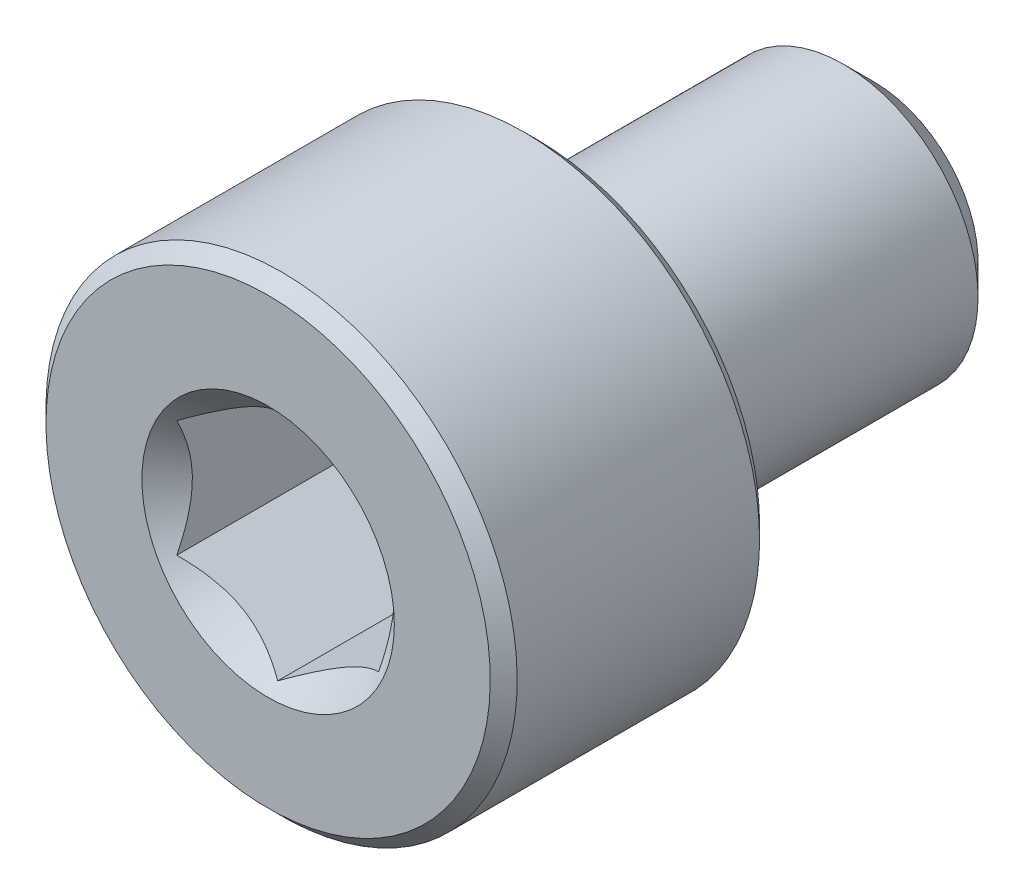
ISO-10303-21;
HEADER;
FILE_DESCRIPTION(('STEP AP214'),'2;1');
FILE_NAME('part.step','',(''),(''),'','','');
FILE_SCHEMA(('AUTOMOTIVE_DESIGN { 1 0 10303 214 1 1 1 1 }'));
ENDSEC;
DATA;
#1=APPLICATION_CONTEXT('core data for automotive mechanical design processes');
#2=APPLICATION_PROTOCOL_DEFINITION('international standard','automotive_design',2000,#1);
#3=PRODUCT_CONTEXT('',#1,'mechanical');
#4=PRODUCT('Part','Part','',(#3));
#5=PRODUCT_RELATED_PRODUCT_CATEGORY('part','',(#4));
#6=PRODUCT_DEFINITION_FORMATION('','',#4);
#7=PRODUCT_DEFINITION_CONTEXT('part definition',#1,'design');
#8=PRODUCT_DEFINITION('design','',#6,#7);
#9=PRODUCT_DEFINITION_SHAPE('','',#8);
#10=(LENGTH_UNIT() NAMED_UNIT(*) SI_UNIT(.MILLI.,.METRE.));
#11=(NAMED_UNIT(*) PLANE_ANGLE_UNIT() SI_UNIT($,.RADIAN.));
#12=(NAMED_UNIT(*) SI_UNIT($,.STERADIAN.) SOLID_ANGLE_UNIT());
#13=UNCERTAINTY_MEASURE_WITH_UNIT(LENGTH_MEASURE(1.E-05),#10,'distance_accuracy_value','');
#14=(GEOMETRIC_REPRESENTATION_CONTEXT(3) GLOBAL_UNCERTAINTY_ASSIGNED_CONTEXT((#13)) GLOBAL_UNIT_ASSIGNED_CONTEXT((#10,
#11,#12)) REPRESENTATION_CONTEXT('',''));
#15=CARTESIAN_POINT('',(0.,0.,0.));
#16=DIRECTION('',(0.,0.,1.));
#17=DIRECTION('',(1.,0.,0.));
#18=AXIS2_PLACEMENT_3D('',#15,#16,#17);
#19=CARTESIAN_POINT('',(0.,1.54533666301317,-4.5));
#20=DIRECTION('',(0.,0.,-1.));
#21=DIRECTION('',(0.,1.,0.));
#22=AXIS2_PLACEMENT_3D('',#19,#20,#21);
#23=PLANE('',#22);
#24=CARTESIAN_POINT('',(0.,0.,-4.5));
#25=DIRECTION('',(0.,0.,-1.));
#26=DIRECTION('',(0.,1.,0.));
#27=AXIS2_PLACEMENT_3D('',#24,#25,#26);
#28=CIRCLE('',#27,1.54533666301317);
#29=CARTESIAN_POINT('',(0.,1.54533666301317,-4.5));
#30=VERTEX_POINT('',#29);
#31=EDGE_CURVE('E58',#30,#30,#28,.T.);
#32=ORIENTED_EDGE('',*,*,#31,.T.);
#33=EDGE_LOOP('',(#32));
#34=FACE_BOUND('',#33,.T.);
#35=ADVANCED_FACE('F45',(#34),#23,.T.);
#36=CARTESIAN_POINT('',(0.,0.,-4.5));
#37=DIRECTION('',(0.,0.,1.));
#38=DIRECTION('',(0.,-1.,0.));
#39=AXIS2_PLACEMENT_3D('',#36,#37,#38);
#40=CONICAL_SURFACE('',#39,1.54533666301317,0.785398163397445);
#41=CARTESIAN_POINT('',(0.,0.,-4.04533666301317));
#42=DIRECTION('',(0.,0.,-1.));
#43=DIRECTION('',(0.,1.,0.));
#44=AXIS2_PLACEMENT_3D('',#41,#42,#43);
#45=CIRCLE('',#44,2.);
#46=CARTESIAN_POINT('',(0.,2.,-4.04533666301317));
#47=VERTEX_POINT('',#46);
#48=EDGE_CURVE('E161',#47,#47,#45,.T.);
#49=ORIENTED_EDGE('',*,*,#48,.T.);
#50=EDGE_LOOP('',(#49));
#51=FACE_BOUND('',#50,.T.);
#52=ORIENTED_EDGE('',*,*,#31,.F.);
#53=EDGE_LOOP('',(#52));
#54=FACE_BOUND('',#53,.T.);
#55=ADVANCED_FACE('F167',(#51,#54),#40,.T.);
#56=CARTESIAN_POINT('',(0.,0.,-4.5));
#57=DIRECTION('',(0.,0.,-1.));
#58=DIRECTION('',(0.,1.,0.));
#59=AXIS2_PLACEMENT_3D('',#56,#57,#58);
#60=CYLINDRICAL_SURFACE('',#59,2.);
#61=CARTESIAN_POINT('',(0.,0.,0.3));
#62=DIRECTION('',(0.,0.,-1.));
#63=DIRECTION('',(0.,1.,0.));
#64=AXIS2_PLACEMENT_3D('',#61,#62,#63);
#65=CIRCLE('',#64,2.);
#66=CARTESIAN_POINT('',(0.,2.,0.3));
#67=VERTEX_POINT('',#66);
#68=EDGE_CURVE('E158',#67,#67,#65,.T.);
#69=ORIENTED_EDGE('',*,*,#68,.T.);
#70=EDGE_LOOP('',(#69));
#71=FACE_BOUND('',#70,.T.);
#72=ORIENTED_EDGE('',*,*,#48,.F.);
#73=EDGE_LOOP('',(#72));
#74=FACE_BOUND('',#73,.T.);
#75=ADVANCED_FACE('F169',(#71,#74),#60,.T.);
#76=CARTESIAN_POINT('',(0.,0.,0.3));
#77=DIRECTION('',(0.,0.,-1.));
#78=DIRECTION('',(0.,1.,0.));
#79=AXIS2_PLACEMENT_3D('',#76,#77,#78);
#80=TOROIDAL_SURFACE('',#79,2.2,0.2);
#81=CARTESIAN_POINT('',(0.,0.,0.5));
#82=DIRECTION('',(0.,0.,-1.));
#83=DIRECTION('',(0.,1.,0.));
#84=AXIS2_PLACEMENT_3D('',#81,#82,#83);
#85=CIRCLE('',#84,2.2);
#86=CARTESIAN_POINT('',(0.,2.2,0.5));
#87=VERTEX_POINT('',#86);
#88=EDGE_CURVE('E155',#87,#87,#85,.T.);
#89=ORIENTED_EDGE('',*,*,#88,.T.);
#90=EDGE_LOOP('',(#89));
#91=FACE_BOUND('',#90,.T.);
#92=ORIENTED_EDGE('',*,*,#68,.F.);
#93=EDGE_LOOP('',(#92));
#94=FACE_BOUND('',#93,.T.);
#95=ADVANCED_FACE('F175',(#91,#94),#80,.F.);
#96=CARTESIAN_POINT('',(0.,3.3,0.5));
#97=DIRECTION('',(0.,0.,-1.));
#98=DIRECTION('',(0.,1.,0.));
#99=AXIS2_PLACEMENT_3D('',#96,#97,#98);
#100=PLANE('',#99);
#101=CARTESIAN_POINT('',(0.,0.,0.5));
#102=DIRECTION('',(0.,0.,-1.));
#103=DIRECTION('',(0.,1.,0.));
#104=AXIS2_PLACEMENT_3D('',#101,#102,#103);
#105=CIRCLE('',#104,3.3);
#106=CARTESIAN_POINT('',(0.,3.3,0.5));
#107=VERTEX_POINT('',#106);
#108=EDGE_CURVE('E152',#107,#107,#105,.T.);
#109=ORIENTED_EDGE('',*,*,#108,.T.);
#110=EDGE_LOOP('',(#109));
#111=FACE_BOUND('',#110,.T.);
#112=ORIENTED_EDGE('',*,*,#88,.F.);
#113=EDGE_LOOP('',(#112));
#114=FACE_BOUND('',#113,.T.);
#115=ADVANCED_FACE('F181',(#111,#114),#100,.T.);
#116=CARTESIAN_POINT('',(0.,0.,0.5));
#117=DIRECTION('',(0.,0.,1.));
#118=DIRECTION('',(0.,-1.,0.));
#119=AXIS2_PLACEMENT_3D('',#116,#117,#118);
#120=CONICAL_SURFACE('',#119,3.3,0.785398163397449);
#121=CARTESIAN_POINT('',(0.,0.,0.7));
#122=DIRECTION('',(0.,0.,-1.));
#123=DIRECTION('',(0.,1.,0.));
#124=AXIS2_PLACEMENT_3D('',#121,#122,#123);
#125=CIRCLE('',#124,3.5);
#126=CARTESIAN_POINT('',(0.,3.5,0.7));
#127=VERTEX_POINT('',#126);
#128=EDGE_CURVE('E149',#127,#127,#125,.T.);
#129=ORIENTED_EDGE('',*,*,#128,.T.);
#130=EDGE_LOOP('',(#129));
#131=FACE_BOUND('',#130,.T.);
#132=ORIENTED_EDGE('',*,*,#108,.F.);
#133=EDGE_LOOP('',(#132));
#134=FACE_BOUND('',#133,.T.);
#135=ADVANCED_FACE('F185',(#131,#134),#120,.T.);
#136=CARTESIAN_POINT('',(0.,0.,-4.5));
#137=DIRECTION('',(0.,0.,-1.));
#138=DIRECTION('',(0.,1.,0.));
#139=AXIS2_PLACEMENT_3D('',#136,#137,#138);
#140=CYLINDRICAL_SURFACE('',#139,3.5);
#141=CARTESIAN_POINT('',(0.,0.,4.3));
#142=DIRECTION('',(0.,0.,-1.));
#143=DIRECTION('',(0.,1.,0.));
#144=AXIS2_PLACEMENT_3D('',#141,#142,#143);
#145=CIRCLE('',#144,3.5);
#146=CARTESIAN_POINT('',(0.,3.5,4.3));
#147=VERTEX_POINT('',#146);
#148=EDGE_CURVE('E146',#147,#147,#145,.T.);
#149=ORIENTED_EDGE('',*,*,#148,.T.);
#150=EDGE_LOOP('',(#149));
#151=FACE_BOUND('',#150,.T.);
#152=ORIENTED_EDGE('',*,*,#128,.F.);
#153=EDGE_LOOP('',(#152));
#154=FACE_BOUND('',#153,.T.);
#155=ADVANCED_FACE('F189',(#151,#154),#140,.T.);
#156=CARTESIAN_POINT('',(0.,0.,4.3));
#157=DIRECTION('',(0.,0.,-1.));
#158=DIRECTION('',(0.,1.,0.));
#159=AXIS2_PLACEMENT_3D('',#156,#157,#158);
#160=CONICAL_SURFACE('',#159,3.5,0.785398163397452);
#161=CARTESIAN_POINT('',(0.,0.,4.5));
#162=DIRECTION('',(0.,0.,-1.));
#163=DIRECTION('',(0.,1.,0.));
#164=AXIS2_PLACEMENT_3D('',#161,#162,#163);
#165=CIRCLE('',#164,3.3);
#166=CARTESIAN_POINT('',(0.,3.3,4.5));
#167=VERTEX_POINT('',#166);
#168=EDGE_CURVE('E143',#167,#167,#165,.T.);
#169=ORIENTED_EDGE('',*,*,#168,.T.);
#170=EDGE_LOOP('',(#169));
#171=FACE_BOUND('',#170,.T.);
#172=ORIENTED_EDGE('',*,*,#148,.F.);
#173=EDGE_LOOP('',(#172));
#174=FACE_BOUND('',#173,.T.);
#175=ADVANCED_FACE('F193',(#171,#174),#160,.T.);
#176=CARTESIAN_POINT('',(0.,0.,4.5));
#177=DIRECTION('',(0.,0.,1.));
#178=DIRECTION('',(0.,-1.,0.));
#179=AXIS2_PLACEMENT_3D('',#176,#177,#178);
#180=PLANE('',#179);
#181=CARTESIAN_POINT('',(0.,0.,4.5));
#182=DIRECTION('',(0.,0.,1.));
#183=DIRECTION('',(1.,0.,0.));
#184=AXIS2_PLACEMENT_3D('',#181,#182,#183);
#185=CIRCLE('',#184,1.875);
#186=CARTESIAN_POINT('',(1.875,0.,4.5));
#187=VERTEX_POINT('',#186);
#188=EDGE_CURVE('E117',#187,#187,#185,.T.);
#189=ORIENTED_EDGE('',*,*,#188,.F.);
#190=EDGE_LOOP('',(#189));
#191=FACE_BOUND('',#190,.T.);
#192=ORIENTED_EDGE('',*,*,#168,.F.);
#193=EDGE_LOOP('',(#192));
#194=FACE_BOUND('',#193,.T.);
#195=ADVANCED_FACE('F197',(#191,#194),#180,.T.);
#196=CARTESIAN_POINT('',(0.,0.,4.5));
#197=DIRECTION('',(0.,0.,1.));
#198=DIRECTION('',(1.,0.,0.));
#199=AXIS2_PLACEMENT_3D('',#196,#197,#198);
#200=CONICAL_SURFACE('',#199,1.875,0.78539816339745);
#201=ORIENTED_EDGE('',*,*,#188,.T.);
#202=EDGE_LOOP('',(#201));
#203=FACE_BOUND('',#202,.T.);
#204=CARTESIAN_POINT('',(-0.000200000000000217,-1.73216627762272,4.35716628916895));
#205=CARTESIAN_POINT('',(0.0513677907370751,-1.70239359975915,4.32741628363621));
#206=CARTESIAN_POINT('',(0.1037979176652,-1.67212305186355,4.29941329147919));
#207=CARTESIAN_POINT('',(0.210709034055596,-1.61039789003619,4.24814003800902));
#208=CARTESIAN_POINT('',(0.265200195814661,-1.57893740312614,4.22489831261325));
#209=CARTESIAN_POINT('',(0.375079081357249,-1.51549879897987,4.1850845365611));
#210=CARTESIAN_POINT('',(0.4304388090952,-1.4835368452681,4.16841239323977));
#211=CARTESIAN_POINT('',(0.542377257477151,-1.41890915196211,4.14272526438698));
#212=CARTESIAN_POINT('',(0.598952556553009,-1.38624538781118,4.13369109804774));
#213=CARTESIAN_POINT('',(0.696455389516442,-1.32995210095299,4.12553988879573));
#214=CARTESIAN_POINT('',(0.737256908280467,-1.30639533311124,4.1243330605581));
#215=CARTESIAN_POINT('',(0.818787969615859,-1.25932335290193,4.12636486473115));
#216=CARTESIAN_POINT('',(0.859517494314631,-1.23580815085313,4.12960447831719));
#217=CARTESIAN_POINT('',(0.940584402163417,-1.18900414978427,4.14034279355084));
#218=CARTESIAN_POINT('',(0.980921384598289,-1.16571558211719,4.14784546058761));
#219=CARTESIAN_POINT('',(1.06091833691403,-1.11952932016335,4.16670241949717));
#220=CARTESIAN_POINT('',(1.10057800851621,-1.09663179808786,4.17805836458746));
#221=CARTESIAN_POINT('',(1.20216313477449,-1.03798159809698,4.21177245516155));
#222=CARTESIAN_POINT('',(1.26345855370969,-1.00259267147465,4.23667265666225));
#223=CARTESIAN_POINT('',(1.35358562846331,-0.950557780604374,4.27870746084045));
#224=CARTESIAN_POINT('',(1.38328513990772,-0.933410759677147,4.29347596112797));
#225=CARTESIAN_POINT('',(1.44213790138375,-0.899432101996407,4.32436137350905));
#226=CARTESIAN_POINT('',(1.47129140422064,-0.88260031928571,4.34047764169059));
#227=CARTESIAN_POINT('',(1.5002,-0.865909933730601,4.35716628916895));
#228=B_SPLINE_CURVE_WITH_KNOTS('',3,(#204,#205,#206,#207,#208,#209,#210,#211,#212,#213,#214,
#215,#216,#217,#218,#219,#220,#221,#222,#223,#224,#225,#226,#227),.UNSPECIFIED.,.F.,.F.,(4,2,2,
2,2,2,2,2,2,2,2,4),(0.,0.199829143693305,0.400822987382389,0.598623720538182,0.795926240188891,
0.937113067959883,1.07833105577193,1.21968061668222,1.36109089931055,1.58570969637566,
1.69770705470964,1.80965120737194),.UNSPECIFIED.);
#229=CARTESIAN_POINT('',(0.,-1.73205080756888,4.35705080756888));
#230=VERTEX_POINT('',#229);
#231=CARTESIAN_POINT('',(1.5,-0.866025403784439,4.35705080756888));
#232=VERTEX_POINT('',#231);
#233=EDGE_CURVE('E12',#230,#232,#228,.T.);
#234=ORIENTED_EDGE('',*,*,#233,.F.);
#235=CARTESIAN_POINT('',(-1.5002,-0.865909933730601,4.35716628916895));
#236=CARTESIAN_POINT('',(-1.44863220926292,-0.895682611594166,4.32741628363621));
#237=CARTESIAN_POINT('',(-1.3962020823348,-0.925953159489765,4.29941329147919));
#238=CARTESIAN_POINT('',(-1.2892909659444,-0.987678321317123,4.24814003800902));
#239=CARTESIAN_POINT('',(-1.23479980418534,-1.01913880822717,4.22489831261325));
#240=CARTESIAN_POINT('',(-1.12492091864275,-1.08257741237344,4.1850845365611));
#241=CARTESIAN_POINT('',(-1.0695611909048,-1.11453936608521,4.16841239323977));
#242=CARTESIAN_POINT('',(-0.957622742522849,-1.1791670593912,4.14272526438698));
#243=CARTESIAN_POINT('',(-0.901047443446991,-1.21183082354213,4.13369109804774));
#244=CARTESIAN_POINT('',(-0.803544610483559,-1.26812411040032,4.12553988879573));
#245=CARTESIAN_POINT('',(-0.762743091719534,-1.29168087824208,4.12433306055809));
#246=CARTESIAN_POINT('',(-0.681212030384142,-1.33875285845138,4.12636486473115));
#247=CARTESIAN_POINT('',(-0.64048250568537,-1.36226806050018,4.12960447831719));
#248=CARTESIAN_POINT('',(-0.559415597836584,-1.40907206156905,4.14034279355084));
#249=CARTESIAN_POINT('',(-0.519078615401712,-1.43236062923612,4.14784546058761));
#250=CARTESIAN_POINT('',(-0.439081663085969,-1.47854689118996,4.16670241949717));
#251=CARTESIAN_POINT('',(-0.399421991483792,-1.50144441326545,4.17805836458746));
#252=CARTESIAN_POINT('',(-0.297836865225515,-1.56009461325633,4.21177245516155));
#253=CARTESIAN_POINT('',(-0.236541446290311,-1.59548353987866,4.23667265666225));
#254=CARTESIAN_POINT('',(-0.146414371536687,-1.64751843074894,4.27870746084045));
#255=CARTESIAN_POINT('',(-0.116714860092283,-1.66466545167617,4.29347596112797));
#256=CARTESIAN_POINT('',(-0.0578620986162493,-1.69864410935691,4.32436137350905));
#257=CARTESIAN_POINT('',(-0.0287085957793629,-1.71547589206761,4.34047764169059));
#258=CARTESIAN_POINT('',(0.000199999999999868,-1.73216627762272,4.35716628916895));
#259=B_SPLINE_CURVE_WITH_KNOTS('',3,(#235,#236,#237,#238,#239,#240,#241,#242,#243,#244,#245,
#246,#247,#248,#249,#250,#251,#252,#253,#254,#255,#256,#257,#258),.UNSPECIFIED.,.F.,.F.,(4,2,2,
2,2,2,2,2,2,2,2,4),(0.,0.199829143693305,0.400822987382388,0.59862372053818,0.795926240188889,
0.937113067959881,1.07833105577193,1.21968061668222,1.36109089931054,1.58570969637565,
1.69770705470963,1.80965120737194),.UNSPECIFIED.);
#260=CARTESIAN_POINT('',(-1.5,-0.866025403784439,4.35705080756888));
#261=VERTEX_POINT('',#260);
#262=EDGE_CURVE('E103',#261,#230,#259,.T.);
#263=ORIENTED_EDGE('',*,*,#262,.F.);
#264=CARTESIAN_POINT('',(-1.5,-1.82724616303013,4.9890703331983));
#265=CARTESIAN_POINT('',(-1.5,-1.78317586660663,4.95501239995677));
#266=CARTESIAN_POINT('',(-1.5,-1.73887128511932,4.9212586157948));
#267=CARTESIAN_POINT('',(-1.5,-1.64969483826883,4.85448777226094));
#268=CARTESIAN_POINT('',(-1.5,-1.60482284303167,4.82147088651893));
#269=CARTESIAN_POINT('',(-1.5,-1.46855205058729,4.72324713276));
#270=CARTESIAN_POINT('',(-1.5,-1.37616527732981,4.65938887980909));
#271=CARTESIAN_POINT('',(-1.5,-1.18175814530896,4.53306555241423));
#272=CARTESIAN_POINT('',(-1.5,-1.07950173722928,4.47096001610314));
#273=CARTESIAN_POINT('',(-1.5,-0.869762030917011,4.35669692365494));
#274=CARTESIAN_POINT('',(-1.5,-0.762297993140727,4.3045057692236));
#275=CARTESIAN_POINT('',(-1.5,-0.601919355462973,4.24062745548581));
#276=CARTESIAN_POINT('',(-1.5,-0.551595099321828,4.22247344848169));
#277=CARTESIAN_POINT('',(-1.5,-0.449644044337813,4.19019628138117));
#278=CARTESIAN_POINT('',(-1.5,-0.398017164202741,4.17607337353211));
#279=CARTESIAN_POINT('',(-1.5,-0.294682921970128,4.15286025130534));
#280=CARTESIAN_POINT('',(-1.5,-0.242996732973226,4.14367732834991));
#281=CARTESIAN_POINT('',(-1.5,-0.138960185913602,4.13054010534325));
#282=CARTESIAN_POINT('',(-1.5,-0.0866099744987001,4.12658467043386));
#283=CARTESIAN_POINT('',(-1.5,0.0158213358469601,4.12424944439602));
#284=CARTESIAN_POINT('',(-1.5,0.0658968533581893,4.12562321720099));
#285=CARTESIAN_POINT('',(-1.5,0.165665754885722,4.13330038456717));
#286=CARTESIAN_POINT('',(-1.5,0.215359104450809,4.13960421841715));
#287=CARTESIAN_POINT('',(-1.5,0.314848006923591,4.15688863172927));
#288=CARTESIAN_POINT('',(-1.5,0.364628847818077,4.16795253034827));
#289=CARTESIAN_POINT('',(-1.5,0.463087713283466,4.19413916239748));
#290=CARTESIAN_POINT('',(-1.5,0.511765792737121,4.2092616933524));
#291=CARTESIAN_POINT('',(-1.5,0.660788843897246,4.26136082058242));
#292=CARTESIAN_POINT('',(-1.5,0.759116657247093,4.30408886600696));
#293=CARTESIAN_POINT('',(-1.5,0.951184482463469,4.3991892536357));
#294=CARTESIAN_POINT('',(-1.5,1.04490689498041,4.45159542441679));
#295=CARTESIAN_POINT('',(-1.5,1.22407036992814,4.55981955502163));
#296=CARTESIAN_POINT('',(-1.5,1.30969196520695,4.61534242328386));
#297=CARTESIAN_POINT('',(-1.5,1.43583732283972,4.70122204414168));
#298=CARTESIAN_POINT('',(-1.5,1.47734359009407,4.73016065506323));
#299=CARTESIAN_POINT('',(-1.5,1.5597863256648,4.78881558305804));
#300=CARTESIAN_POINT('',(-1.5,1.60072294793761,4.81853168349227));
#301=CARTESIAN_POINT('',(-1.5,1.64142194027434,4.84857054891766));
#302=B_SPLINE_CURVE_WITH_KNOTS('',3,(#264,#265,#266,#267,#268,#269,#270,#271,#272,#273,#274,
#275,#276,#277,#278,#279,#280,#281,#282,#283,#284,#285,#286,#287,#288,#289,#290,#291,#292,#293,
#294,#295,#296,#297,#298,#299,#300,#301),.UNSPECIFIED.,.F.,.F.,(4,2,2,2,2,2,2,2,2,2,2,2,2,2,2,2,
2,2,4),(0.,0.167086436601661,0.334211835551281,0.671001298251586,1.02965358816391,
1.38706788816987,1.54743005800718,1.70780226036013,1.86504930542637,2.02226220743606,
2.17229379545786,2.32233875343611,2.47512433054573,2.62790228697088,2.94859878977715,
3.27043822191845,3.57642907004227,3.72821874189076,3.87996656039158),.UNSPECIFIED.);
#303=CARTESIAN_POINT('',(-1.5,0.866025403784438,4.35705080756888));
#304=VERTEX_POINT('',#303);
#305=EDGE_CURVE('E116',#304,#261,#302,.F.);
#306=ORIENTED_EDGE('',*,*,#305,.F.);
#307=CARTESIAN_POINT('',(0.000199999999999728,1.73216627762271,4.35716628916895));
#308=CARTESIAN_POINT('',(-0.0513677907370761,1.70239359975915,4.32741628363621));
#309=CARTESIAN_POINT('',(-0.103797917665201,1.67212305186355,4.29941329147919));
#310=CARTESIAN_POINT('',(-0.210709034055597,1.61039789003619,4.24814003800902));
#311=CARTESIAN_POINT('',(-0.265200195814661,1.57893740312614,4.22489831261325));
#312=CARTESIAN_POINT('',(-0.375079081357249,1.51549879897987,4.1850845365611));
#313=CARTESIAN_POINT('',(-0.4304388090952,1.4835368452681,4.16841239323977));
#314=CARTESIAN_POINT('',(-0.542377257477151,1.41890915196211,4.14272526438698));
#315=CARTESIAN_POINT('',(-0.598952556553009,1.38624538781118,4.13369109804774));
#316=CARTESIAN_POINT('',(-0.696455389516441,1.32995210095299,4.12553988879573));
#317=CARTESIAN_POINT('',(-0.737256908280467,1.30639533311124,4.12433306055809));
#318=CARTESIAN_POINT('',(-0.818787969615859,1.25932335290193,4.12636486473115));
#319=CARTESIAN_POINT('',(-0.859517494314631,1.23580815085313,4.12960447831719));
#320=CARTESIAN_POINT('',(-0.940584402163417,1.18900414978427,4.14034279355084));
#321=CARTESIAN_POINT('',(-0.980921384598289,1.16571558211719,4.14784546058761));
#322=CARTESIAN_POINT('',(-1.06091833691403,1.11952932016335,4.16670241949717));
#323=CARTESIAN_POINT('',(-1.10057800851621,1.09663179808786,4.17805836458746));
#324=CARTESIAN_POINT('',(-1.20216313477449,1.03798159809698,4.21177245516155));
#325=CARTESIAN_POINT('',(-1.26345855370969,1.00259267147465,4.23667265666225));
#326=CARTESIAN_POINT('',(-1.35358562846331,0.950557780604374,4.27870746084045));
#327=CARTESIAN_POINT('',(-1.38328513990772,0.933410759677147,4.29347596112797));
#328=CARTESIAN_POINT('',(-1.44213790138375,0.899432101996406,4.32436137350905));
#329=CARTESIAN_POINT('',(-1.47129140422064,0.88260031928571,4.34047764169059));
#330=CARTESIAN_POINT('',(-1.5002,0.8659099337306,4.35716628916895));
#331=B_SPLINE_CURVE_WITH_KNOTS('',3,(#307,#308,#309,#310,#311,#312,#313,#314,#315,#316,#317,
#318,#319,#320,#321,#322,#323,#324,#325,#326,#327,#328,#329,#330),.UNSPECIFIED.,.F.,.F.,(4,2,2,
2,2,2,2,2,2,2,2,4),(0.,0.199829143693305,0.400822987382389,0.598623720538181,0.79592624018889,
0.937113067959882,1.07833105577193,1.21968061668222,1.36109089931055,1.58570969637566,
1.69770705470964,1.80965120737194),.UNSPECIFIED.);
#332=CARTESIAN_POINT('',(0.,1.73205080756888,4.35705080756888));
#333=VERTEX_POINT('',#332);
#334=EDGE_CURVE('E247',#333,#304,#331,.T.);
#335=ORIENTED_EDGE('',*,*,#334,.F.);
#336=CARTESIAN_POINT('',(1.5002,0.865909933730601,4.35716628916895));
#337=CARTESIAN_POINT('',(1.44863220926292,0.895682611594166,4.32741628363621));
#338=CARTESIAN_POINT('',(1.3962020823348,0.925953159489765,4.29941329147919));
#339=CARTESIAN_POINT('',(1.2892909659444,0.987678321317123,4.24814003800902));
#340=CARTESIAN_POINT('',(1.23479980418534,1.01913880822717,4.22489831261325));
#341=CARTESIAN_POINT('',(1.12492091864275,1.08257741237344,4.1850845365611));
#342=CARTESIAN_POINT('',(1.0695611909048,1.11453936608521,4.16841239323977));
#343=CARTESIAN_POINT('',(0.957622742522849,1.1791670593912,4.14272526438698));
#344=CARTESIAN_POINT('',(0.901047443446991,1.21183082354213,4.13369109804774));
#345=CARTESIAN_POINT('',(0.803544610483559,1.26812411040032,4.12553988879573));
#346=CARTESIAN_POINT('',(0.762743091719533,1.29168087824208,4.12433306055809));
#347=CARTESIAN_POINT('',(0.681212030384141,1.33875285845138,4.12636486473115));
#348=CARTESIAN_POINT('',(0.64048250568537,1.36226806050018,4.12960447831718));
#349=CARTESIAN_POINT('',(0.559415597836584,1.40907206156905,4.14034279355084));
#350=CARTESIAN_POINT('',(0.519078615401712,1.43236062923612,4.14784546058761));
#351=CARTESIAN_POINT('',(0.439081663085969,1.47854689118996,4.16670241949717));
#352=CARTESIAN_POINT('',(0.399421991483792,1.50144441326545,4.17805836458746));
#353=CARTESIAN_POINT('',(0.297836865225515,1.56009461325633,4.21177245516155));
#354=CARTESIAN_POINT('',(0.236541446290311,1.59548353987866,4.23667265666225));
#355=CARTESIAN_POINT('',(0.146414371536686,1.64751843074894,4.27870746084045));
#356=CARTESIAN_POINT('',(0.116714860092282,1.66466545167617,4.29347596112797));
#357=CARTESIAN_POINT('',(0.0578620986162484,1.69864410935691,4.32436137350905));
#358=CARTESIAN_POINT('',(0.0287085957793621,1.71547589206761,4.34047764169059));
#359=CARTESIAN_POINT('',(-0.000200000000000577,1.73216627762271,4.35716628916895));
#360=B_SPLINE_CURVE_WITH_KNOTS('',3,(#336,#337,#338,#339,#340,#341,#342,#343,#344,#345,#346,
#347,#348,#349,#350,#351,#352,#353,#354,#355,#356,#357,#358,#359),.UNSPECIFIED.,.F.,.F.,(4,2,2,
2,2,2,2,2,2,2,2,4),(0.,0.199829143693305,0.400822987382389,0.598623720538182,0.79592624018889,
0.937113067959882,1.07833105577193,1.21968061668222,1.36109089931054,1.58570969637565,
1.69770705470964,1.80965120737194),.UNSPECIFIED.);
#361=CARTESIAN_POINT('',(1.5,0.866025403784438,4.35705080756888));
#362=VERTEX_POINT('',#361);
#363=EDGE_CURVE('E220',#362,#333,#360,.T.);
#364=ORIENTED_EDGE('',*,*,#363,.F.);
#365=CARTESIAN_POINT('',(1.5,-1.82724616303013,4.9890703331983));
#366=CARTESIAN_POINT('',(1.5,-1.78317586660663,4.95501239995677));
#367=CARTESIAN_POINT('',(1.5,-1.73887128511932,4.9212586157948));
#368=CARTESIAN_POINT('',(1.5,-1.64969483826883,4.85448777226094));
#369=CARTESIAN_POINT('',(1.5,-1.60482284303166,4.82147088651893));
#370=CARTESIAN_POINT('',(1.5,-1.46855205058729,4.72324713276));
#371=CARTESIAN_POINT('',(1.5,-1.37616527732981,4.65938887980909));
#372=CARTESIAN_POINT('',(1.5,-1.18175814530896,4.53306555241423));
#373=CARTESIAN_POINT('',(1.5,-1.07950173722928,4.47096001610314));
#374=CARTESIAN_POINT('',(1.5,-0.86976203091701,4.35669692365494));
#375=CARTESIAN_POINT('',(1.5,-0.762297993140727,4.3045057692236));
#376=CARTESIAN_POINT('',(1.5,-0.601919355462973,4.24062745548581));
#377=CARTESIAN_POINT('',(1.5,-0.551595099321827,4.22247344848169));
#378=CARTESIAN_POINT('',(1.5,-0.449644044337812,4.19019628138117));
#379=CARTESIAN_POINT('',(1.5,-0.398017164202741,4.17607337353211));
#380=CARTESIAN_POINT('',(1.5,-0.294682921970128,4.15286025130534));
#381=CARTESIAN_POINT('',(1.5,-0.242996732973227,4.14367732834991));
#382=CARTESIAN_POINT('',(1.5,-0.138960185913602,4.13054010534325));
#383=CARTESIAN_POINT('',(1.5,-0.0866099744987009,4.12658467043386));
#384=CARTESIAN_POINT('',(1.5,0.0158213358469593,4.12424944439603));
#385=CARTESIAN_POINT('',(1.5,0.0658968533581887,4.12562321720099));
#386=CARTESIAN_POINT('',(1.5,0.165665754885722,4.13330038456716));
#387=CARTESIAN_POINT('',(1.5,0.215359104450808,4.13960421841715));
#388=CARTESIAN_POINT('',(1.5,0.314848006923591,4.15688863172927));
#389=CARTESIAN_POINT('',(1.5,0.364628847818077,4.16795253034827));
#390=CARTESIAN_POINT('',(1.5,0.463087713283465,4.19413916239748));
#391=CARTESIAN_POINT('',(1.5,0.511765792737121,4.2092616933524));
#392=CARTESIAN_POINT('',(1.5,0.660788843897245,4.26136082058242));
#393=CARTESIAN_POINT('',(1.5,0.759116657247092,4.30408886600696));
#394=CARTESIAN_POINT('',(1.5,0.951184482463468,4.3991892536357));
#395=CARTESIAN_POINT('',(1.5,1.04490689498041,4.45159542441679));
#396=CARTESIAN_POINT('',(1.5,1.22407036992813,4.55981955502163));
#397=CARTESIAN_POINT('',(1.5,1.30969196520694,4.61534242328386));
#398=CARTESIAN_POINT('',(1.5,1.43583732283972,4.70122204414168));
#399=CARTESIAN_POINT('',(1.5,1.47734359009407,4.73016065506323));
#400=CARTESIAN_POINT('',(1.5,1.55978632566479,4.78881558305804));
#401=CARTESIAN_POINT('',(1.5,1.60072294793761,4.81853168349227));
#402=CARTESIAN_POINT('',(1.5,1.64142194027434,4.84857054891766));
#403=B_SPLINE_CURVE_WITH_KNOTS('',3,(#365,#366,#367,#368,#369,#370,#371,#372,#373,#374,#375,
#376,#377,#378,#379,#380,#381,#382,#383,#384,#385,#386,#387,#388,#389,#390,#391,#392,#393,#394,
#395,#396,#397,#398,#399,#400,#401,#402),.UNSPECIFIED.,.F.,.F.,(4,2,2,2,2,2,2,2,2,2,2,2,2,2,2,2,
2,2,4),(0.,0.16708643660166,0.33421183555128,0.671001298251586,1.02965358816391,
1.38706788816987,1.54743005800718,1.70780226036013,1.86504930542636,2.02226220743606,
2.17229379545786,2.3223387534361,2.47512433054573,2.62790228697088,2.94859878977715,
3.27043822191844,3.57642907004227,3.72821874189075,3.87996656039158),.UNSPECIFIED.);
#404=EDGE_CURVE('E65',#232,#362,#403,.T.);
#405=ORIENTED_EDGE('',*,*,#404,.F.);
#406=EDGE_LOOP('',(#234,#263,#306,#335,#364,#405));
#407=FACE_BOUND('',#406,.T.);
#408=ADVANCED_FACE('F102',(#203,#407),#200,.F.);
#409=CARTESIAN_POINT('',(0.,3.3,1.5));
#410=DIRECTION('',(0.,0.,-1.));
#411=DIRECTION('',(0.,1.,0.));
#412=AXIS2_PLACEMENT_3D('',#409,#410,#411);
#413=PLANE('',#412);
#414=DIRECTION('',(0.866025403784439,0.5,0.));
#415=VECTOR('',#414,1.);
#416=CARTESIAN_POINT('',(0.,-1.73205080756888,1.5));
#417=LINE('',#416,#415);
#418=CARTESIAN_POINT('',(0.,-1.73205080756888,1.5));
#419=VERTEX_POINT('',#418);
#420=CARTESIAN_POINT('',(1.5,-0.866025403784439,1.5));
#421=VERTEX_POINT('',#420);
#422=EDGE_CURVE('E120',#419,#421,#417,.T.);
#423=ORIENTED_EDGE('',*,*,#422,.T.);
#424=DIRECTION('',(0.,1.,0.));
#425=VECTOR('',#424,1.);
#426=CARTESIAN_POINT('',(1.5,-0.866025403784439,1.5));
#427=LINE('',#426,#425);
#428=CARTESIAN_POINT('',(1.5,0.866025403784438,1.5));
#429=VERTEX_POINT('',#428);
#430=EDGE_CURVE('E72',#421,#429,#427,.T.);
#431=ORIENTED_EDGE('',*,*,#430,.T.);
#432=DIRECTION('',(-0.866025403784439,0.5,0.));
#433=VECTOR('',#432,1.);
#434=CARTESIAN_POINT('',(1.5,0.866025403784438,1.5));
#435=LINE('',#434,#433);
#436=CARTESIAN_POINT('',(0.,1.73205080756888,1.5));
#437=VERTEX_POINT('',#436);
#438=EDGE_CURVE('E128',#429,#437,#435,.T.);
#439=ORIENTED_EDGE('',*,*,#438,.T.);
#440=DIRECTION('',(-0.866025403784439,-0.5,0.));
#441=VECTOR('',#440,1.);
#442=CARTESIAN_POINT('',(0.,1.73205080756888,1.5));
#443=LINE('',#442,#441);
#444=CARTESIAN_POINT('',(-1.5,0.866025403784439,1.5));
#445=VERTEX_POINT('',#444);
#446=EDGE_CURVE('E135',#437,#445,#443,.T.);
#447=ORIENTED_EDGE('',*,*,#446,.T.);
#448=DIRECTION('',(0.,-1.,0.));
#449=VECTOR('',#448,1.);
#450=CARTESIAN_POINT('',(-1.5,0.866025403784438,1.5));
#451=LINE('',#450,#449);
#452=CARTESIAN_POINT('',(-1.5,-0.866025403784439,1.5));
#453=VERTEX_POINT('',#452);
#454=EDGE_CURVE('E131',#445,#453,#451,.T.);
#455=ORIENTED_EDGE('',*,*,#454,.T.);
#456=DIRECTION('',(0.866025403784439,-0.5,0.));
#457=VECTOR('',#456,1.);
#458=CARTESIAN_POINT('',(-1.5,-0.866025403784439,1.5));
#459=LINE('',#458,#457);
#460=EDGE_CURVE('E121',#453,#419,#459,.T.);
#461=ORIENTED_EDGE('',*,*,#460,.T.);
#462=EDGE_LOOP('',(#423,#431,#439,#447,#455,#461));
#463=FACE_BOUND('',#462,.T.);
#464=ADVANCED_FACE('F202',(#463),#413,.F.);
#465=CARTESIAN_POINT('',(0.,-1.73205080756888,-4.08257569495584));
#466=DIRECTION('',(0.5,-0.866025403784439,0.));
#467=DIRECTION('',(0.866025403784439,0.5,0.));
#468=AXIS2_PLACEMENT_3D('',#465,#466,#467);
#469=PLANE('',#468);
#470=DIRECTION('',(0.,0.,1.));
#471=VECTOR('',#470,1.);
#472=CARTESIAN_POINT('',(0.,-1.73205080756888,-4.08257569495584));
#473=LINE('',#472,#471);
#474=EDGE_CURVE('E112',#419,#230,#473,.T.);
#475=ORIENTED_EDGE('',*,*,#474,.T.);
#476=ORIENTED_EDGE('',*,*,#233,.T.);
#477=DIRECTION('',(0.,0.,1.));
#478=VECTOR('',#477,1.);
#479=CARTESIAN_POINT('',(1.5,-0.866025403784439,-4.08257569495584));
#480=LINE('',#479,#478);
#481=EDGE_CURVE('E123',#421,#232,#480,.T.);
#482=ORIENTED_EDGE('',*,*,#481,.F.);
#483=ORIENTED_EDGE('',*,*,#422,.F.);
#484=EDGE_LOOP('',(#475,#476,#482,#483));
#485=FACE_BOUND('',#484,.T.);
#486=ADVANCED_FACE('F119',(#485),#469,.F.);
#487=CARTESIAN_POINT('',(-1.5,-0.866025403784439,-4.08257569495584));
#488=DIRECTION('',(-0.5,-0.866025403784439,0.));
#489=DIRECTION('',(0.866025403784439,-0.5,0.));
#490=AXIS2_PLACEMENT_3D('',#487,#488,#489);
#491=PLANE('',#490);
#492=DIRECTION('',(0.,0.,1.));
#493=VECTOR('',#492,1.);
#494=CARTESIAN_POINT('',(-1.5,-0.866025403784439,-4.08257569495584));
#495=LINE('',#494,#493);
#496=EDGE_CURVE('E115',#453,#261,#495,.T.);
#497=ORIENTED_EDGE('',*,*,#496,.T.);
#498=ORIENTED_EDGE('',*,*,#262,.T.);
#499=ORIENTED_EDGE('',*,*,#474,.F.);
#500=ORIENTED_EDGE('',*,*,#460,.F.);
#501=EDGE_LOOP('',(#497,#498,#499,#500));
#502=FACE_BOUND('',#501,.T.);
#503=ADVANCED_FACE('F111',(#502),#491,.F.);
#504=CARTESIAN_POINT('',(-1.5,0.866025403784438,-4.08257569495584));
#505=DIRECTION('',(-1.,0.,0.));
#506=DIRECTION('',(0.,0.,1.));
#507=AXIS2_PLACEMENT_3D('',#504,#505,#506);
#508=PLANE('',#507);
#509=DIRECTION('',(0.,0.,1.));
#510=VECTOR('',#509,1.);
#511=CARTESIAN_POINT('',(-1.5,0.866025403784438,-4.08257569495584));
#512=LINE('',#511,#510);
#513=EDGE_CURVE('E132',#445,#304,#512,.T.);
#514=ORIENTED_EDGE('',*,*,#513,.T.);
#515=ORIENTED_EDGE('',*,*,#305,.T.);
#516=ORIENTED_EDGE('',*,*,#496,.F.);
#517=ORIENTED_EDGE('',*,*,#454,.F.);
#518=EDGE_LOOP('',(#514,#515,#516,#517));
#519=FACE_BOUND('',#518,.T.);
#520=ADVANCED_FACE('F256',(#519),#508,.F.);
#521=CARTESIAN_POINT('',(0.,1.73205080756888,-4.08257569495584));
#522=DIRECTION('',(-0.5,0.866025403784439,0.));
#523=DIRECTION('',(-0.866025403784439,-0.5,0.));
#524=AXIS2_PLACEMENT_3D('',#521,#522,#523);
#525=PLANE('',#524);
#526=DIRECTION('',(0.,0.,1.));
#527=VECTOR('',#526,1.);
#528=CARTESIAN_POINT('',(0.,1.73205080756888,-4.08257569495584));
#529=LINE('',#528,#527);
#530=EDGE_CURVE('E136',#437,#333,#529,.T.);
#531=ORIENTED_EDGE('',*,*,#530,.T.);
#532=ORIENTED_EDGE('',*,*,#334,.T.);
#533=ORIENTED_EDGE('',*,*,#513,.F.);
#534=ORIENTED_EDGE('',*,*,#446,.F.);
#535=EDGE_LOOP('',(#531,#532,#533,#534));
#536=FACE_BOUND('',#535,.T.);
#537=ADVANCED_FACE('F253',(#536),#525,.F.);
#538=CARTESIAN_POINT('',(1.5,0.866025403784438,-4.08257569495584));
#539=DIRECTION('',(0.5,0.866025403784439,0.));
#540=DIRECTION('',(-0.866025403784439,0.5,0.));
#541=AXIS2_PLACEMENT_3D('',#538,#539,#540);
#542=PLANE('',#541);
#543=DIRECTION('',(0.,0.,1.));
#544=VECTOR('',#543,1.);
#545=CARTESIAN_POINT('',(1.5,0.866025403784438,-4.08257569495584));
#546=LINE('',#545,#544);
#547=EDGE_CURVE('E139',#429,#362,#546,.T.);
#548=ORIENTED_EDGE('',*,*,#547,.T.);
#549=ORIENTED_EDGE('',*,*,#363,.T.);
#550=ORIENTED_EDGE('',*,*,#530,.F.);
#551=ORIENTED_EDGE('',*,*,#438,.F.);
#552=EDGE_LOOP('',(#548,#549,#550,#551));
#553=FACE_BOUND('',#552,.T.);
#554=ADVANCED_FACE('F210',(#553),#542,.F.);
#555=CARTESIAN_POINT('',(1.5,-0.866025403784439,-4.08257569495584));
#556=DIRECTION('',(1.,0.,0.));
#557=DIRECTION('',(0.,0.,-1.));
#558=AXIS2_PLACEMENT_3D('',#555,#556,#557);
#559=PLANE('',#558);
#560=ORIENTED_EDGE('',*,*,#481,.T.);
#561=ORIENTED_EDGE('',*,*,#404,.T.);
#562=ORIENTED_EDGE('',*,*,#547,.F.);
#563=ORIENTED_EDGE('',*,*,#430,.F.);
#564=EDGE_LOOP('',(#560,#561,#562,#563));
#565=FACE_BOUND('',#564,.T.);
#566=ADVANCED_FACE('F206',(#565),#559,.F.);
#567=CLOSED_SHELL('',(#35,#55,#75,#95,#115,#135,#155,#175,#195,#408,#464,#486,#503,#520,#537,
#554,#566));
#568=MANIFOLD_SOLID_BREP('B2',#567);
#569=ADVANCED_BREP_SHAPE_REPRESENTATION('',(#18,#568),#14);
#570=SHAPE_DEFINITION_REPRESENTATION(#9,#569);
ENDSEC;
END-ISO-10303-21;
